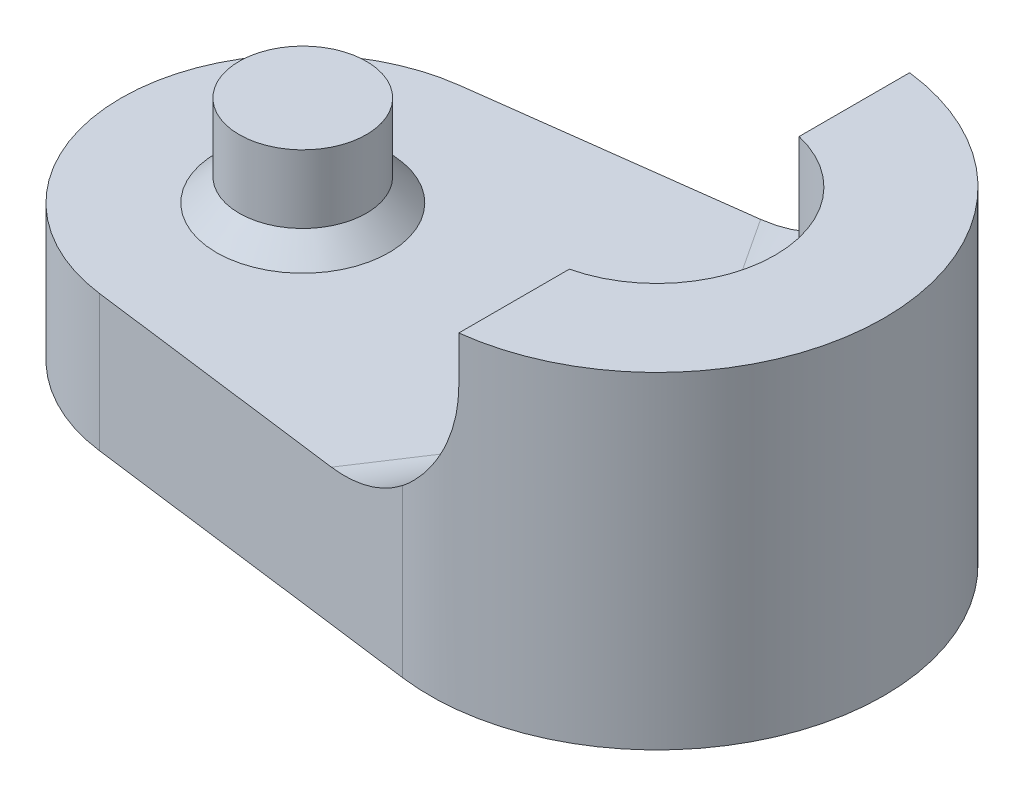
ISO-10303-21;
HEADER;
FILE_DESCRIPTION(('STEP AP214'),'2;1');
FILE_NAME('part.step','',(''),(''),'','','');
FILE_SCHEMA(('AUTOMOTIVE_DESIGN { 1 0 10303 214 1 1 1 1 }'));
ENDSEC;
DATA;
#1=APPLICATION_CONTEXT('core data for automotive mechanical design processes');
#2=APPLICATION_PROTOCOL_DEFINITION('international standard','automotive_design',2000,#1);
#3=PRODUCT_CONTEXT('',#1,'mechanical');
#4=PRODUCT('Part','Part','',(#3));
#5=PRODUCT_RELATED_PRODUCT_CATEGORY('part','',(#4));
#6=PRODUCT_DEFINITION_FORMATION('','',#4);
#7=PRODUCT_DEFINITION_CONTEXT('part definition',#1,'design');
#8=PRODUCT_DEFINITION('design','',#6,#7);
#9=PRODUCT_DEFINITION_SHAPE('','',#8);
#10=(LENGTH_UNIT() NAMED_UNIT(*) SI_UNIT(.MILLI.,.METRE.));
#11=(NAMED_UNIT(*) PLANE_ANGLE_UNIT() SI_UNIT($,.RADIAN.));
#12=(NAMED_UNIT(*) SI_UNIT($,.STERADIAN.) SOLID_ANGLE_UNIT());
#13=UNCERTAINTY_MEASURE_WITH_UNIT(LENGTH_MEASURE(1.E-05),#10,'distance_accuracy_value','');
#14=(GEOMETRIC_REPRESENTATION_CONTEXT(3) GLOBAL_UNCERTAINTY_ASSIGNED_CONTEXT((#13)) GLOBAL_UNIT_ASSIGNED_CONTEXT((#10,
#11,#12)) REPRESENTATION_CONTEXT('',''));
#15=CARTESIAN_POINT('',(0.,0.,0.));
#16=DIRECTION('',(0.,0.,1.));
#17=DIRECTION('',(1.,0.,0.));
#18=AXIS2_PLACEMENT_3D('',#15,#16,#17);
#19=CARTESIAN_POINT('',(-1.95,1.5,0.));
#20=DIRECTION('',(0.,1.,0.));
#21=DIRECTION('',(0.,0.,1.));
#22=AXIS2_PLACEMENT_3D('',#19,#20,#21);
#23=PLANE('',#22);
#24=CARTESIAN_POINT('',(-1.95,1.5,0.));
#25=DIRECTION('',(0.,1.,0.));
#26=DIRECTION('',(0.,0.,1.));
#27=AXIS2_PLACEMENT_3D('',#24,#25,#26);
#28=CIRCLE('',#27,0.950000000000001);
#29=CARTESIAN_POINT('',(-1.95,1.5,0.950000000000001));
#30=VERTEX_POINT('',#29);
#31=EDGE_CURVE('E189',#30,#30,#28,.F.);
#32=ORIENTED_EDGE('',*,*,#31,.T.);
#33=EDGE_LOOP('',(#32));
#34=FACE_BOUND('',#33,.T.);
#35=DIRECTION('',(0.991747672093011,0.,0.128205128205128));
#36=VECTOR('',#35,1.);
#37=CARTESIAN_POINT('',(-2.20641025641026,1.5,1.98349534418602));
#38=LINE('',#37,#36);
#39=CARTESIAN_POINT('',(-2.20641025641026,1.5,1.98349534418602));
#40=VERTEX_POINT('',#39);
#41=CARTESIAN_POINT('',(0.728268226962096,1.5,2.3628668736473));
#42=VERTEX_POINT('',#41);
#43=EDGE_CURVE('E164',#40,#42,#38,.T.);
#44=ORIENTED_EDGE('',*,*,#43,.T.);
#45=CARTESIAN_POINT('',(2.25,1.5,0.0478873989365317));
#46=CARTESIAN_POINT('',(1.98333333333333,1.5,0.453561953980138));
#47=CARTESIAN_POINT('',(1.71666666666667,1.5,0.859236509023745));
#48=CARTESIAN_POINT('',(1.45,1.5,1.26491106406735));
#49=CARTESIAN_POINT('',(1.18333333333333,1.5,1.67058561911096));
#50=CARTESIAN_POINT('',(0.916666666666667,1.5,2.07626017415456));
#51=CARTESIAN_POINT('',(0.65,1.5,2.48193472919817));
#52=CARTESIAN_POINT('',(0.0882208482646619,1.5,3.33655788199695));
#53=CARTESIAN_POINT('',(-0.473558303470676,1.5,4.19118103479573));
#54=CARTESIAN_POINT('',(-1.03533745520601,1.5,5.04580418759451));
#55=(BOUNDED_CURVE() B_SPLINE_CURVE(3,(#45,#46,#47,#48,#49,#50,#51,#52,#53,#54),.UNSPECIFIED.,
.F.,.F.) B_SPLINE_CURVE_WITH_KNOTS((4,3,3,4),(-0.00121702366513082,0.,0.00121702366513082,
0.00378089312352716),
.UNSPECIFIED.) CURVE() GEOMETRIC_REPRESENTATION_ITEM() RATIONAL_B_SPLINE_CURVE((1.,1.,1.,1.,1.,
1.,1.,1.,1.,1.)) REPRESENTATION_ITEM(''));
#56=CARTESIAN_POINT('',(1.48377941939599,1.5,1.21352312306823));
#57=VERTEX_POINT('',#56);
#58=EDGE_CURVE('E265',#42,#57,#55,.F.);
#59=ORIENTED_EDGE('',*,*,#58,.T.);
#60=CARTESIAN_POINT('',(1.95,1.5,0.));
#61=DIRECTION('',(0.,1.,0.));
#62=DIRECTION('',(0.,0.,1.));
#63=AXIS2_PLACEMENT_3D('',#60,#61,#62);
#64=CIRCLE('',#63,1.3);
#65=CARTESIAN_POINT('',(1.48377941939599,1.5,-1.21352312306823));
#66=VERTEX_POINT('',#65);
#67=EDGE_CURVE('E155',#66,#57,#64,.T.);
#68=ORIENTED_EDGE('',*,*,#67,.F.);
#69=CARTESIAN_POINT('',(-1.03533745520602,1.5,-5.04580418759451));
#70=CARTESIAN_POINT('',(-0.473558303470677,1.5,-4.19118103479573));
#71=CARTESIAN_POINT('',(0.0882208482646616,1.5,-3.33655788199695));
#72=CARTESIAN_POINT('',(0.65,1.5,-2.48193472919817));
#73=CARTESIAN_POINT('',(0.916666666666667,1.5,-2.07626017415456));
#74=CARTESIAN_POINT('',(1.18333333333333,1.5,-1.67058561911096));
#75=CARTESIAN_POINT('',(1.45,1.5,-1.26491106406735));
#76=CARTESIAN_POINT('',(1.71666666666667,1.5,-0.859236509023747));
#77=CARTESIAN_POINT('',(1.98333333333333,1.5,-0.453561953980141));
#78=CARTESIAN_POINT('',(2.25,1.5,-0.0478873989365352));
#79=(BOUNDED_CURVE() B_SPLINE_CURVE(3,(#69,#70,#71,#72,#73,#74,#75,#76,#77,#78),.UNSPECIFIED.,
.F.,.F.) B_SPLINE_CURVE_WITH_KNOTS((4,3,3,4),(-0.00256386945839634,0.,0.00121702366513082,
0.00243404733026163),
.UNSPECIFIED.) CURVE() GEOMETRIC_REPRESENTATION_ITEM() RATIONAL_B_SPLINE_CURVE((1.,1.,1.,1.,1.,
1.,1.,1.,1.,1.)) REPRESENTATION_ITEM(''));
#80=CARTESIAN_POINT('',(0.728268226962096,1.5,-2.3628668736473));
#81=VERTEX_POINT('',#80);
#82=EDGE_CURVE('E196',#66,#81,#79,.F.);
#83=ORIENTED_EDGE('',*,*,#82,.T.);
#84=DIRECTION('',(-0.991747672093011,0.,0.128205128205128));
#85=VECTOR('',#84,1.);
#86=CARTESIAN_POINT('',(-2.20641025641026,1.5,-1.98349534418602));
#87=LINE('',#86,#85);
#88=CARTESIAN_POINT('',(-2.20641025641026,1.5,-1.98349534418602));
#89=VERTEX_POINT('',#88);
#90=EDGE_CURVE('E167',#81,#89,#87,.T.);
#91=ORIENTED_EDGE('',*,*,#90,.T.);
#92=CARTESIAN_POINT('',(-1.95,1.5,0.));
#93=DIRECTION('',(0.,1.,0.));
#94=DIRECTION('',(0.,0.,1.));
#95=AXIS2_PLACEMENT_3D('',#92,#93,#94);
#96=CIRCLE('',#95,2.);
#97=EDGE_CURVE('E161',#89,#40,#96,.T.);
#98=ORIENTED_EDGE('',*,*,#97,.T.);
#99=EDGE_LOOP('',(#44,#59,#68,#83,#91,#98));
#100=FACE_BOUND('',#99,.T.);
#101=ADVANCED_FACE('F38',(#34,#100),#23,.T.);
#102=CARTESIAN_POINT('',(-1.95,0.,0.));
#103=DIRECTION('',(0.,1.,0.));
#104=DIRECTION('',(0.,0.,1.));
#105=AXIS2_PLACEMENT_3D('',#102,#103,#104);
#106=PLANE('',#105);
#107=CARTESIAN_POINT('',(-1.95,0.,0.));
#108=DIRECTION('',(0.,1.,0.));
#109=DIRECTION('',(0.,0.,1.));
#110=AXIS2_PLACEMENT_3D('',#107,#108,#109);
#111=CIRCLE('',#110,2.);
#112=CARTESIAN_POINT('',(-2.20641025641026,0.,-1.98349534418602));
#113=VERTEX_POINT('',#112);
#114=CARTESIAN_POINT('',(-2.20641025641026,0.,1.98349534418602));
#115=VERTEX_POINT('',#114);
#116=EDGE_CURVE('E158',#113,#115,#111,.T.);
#117=ORIENTED_EDGE('',*,*,#116,.F.);
#118=DIRECTION('',(-0.991747672093011,0.,0.128205128205128));
#119=VECTOR('',#118,1.);
#120=CARTESIAN_POINT('',(-2.20641025641026,0.,-1.98349534418602));
#121=LINE('',#120,#119);
#122=CARTESIAN_POINT('',(1.62948717948718,0.,-2.47936918023253));
#123=VERTEX_POINT('',#122);
#124=EDGE_CURVE('E165',#123,#113,#121,.T.);
#125=ORIENTED_EDGE('',*,*,#124,.F.);
#126=CARTESIAN_POINT('',(1.95,0.,0.));
#127=DIRECTION('',(0.,1.,0.));
#128=DIRECTION('',(0.,0.,1.));
#129=AXIS2_PLACEMENT_3D('',#126,#127,#128);
#130=CIRCLE('',#129,2.5);
#131=CARTESIAN_POINT('',(1.62948717948718,0.,2.47936918023253));
#132=VERTEX_POINT('',#131);
#133=EDGE_CURVE('E174',#132,#123,#130,.T.);
#134=ORIENTED_EDGE('',*,*,#133,.F.);
#135=DIRECTION('',(0.991747672093011,0.,0.128205128205128));
#136=VECTOR('',#135,1.);
#137=CARTESIAN_POINT('',(-2.20641025641026,0.,1.98349534418602));
#138=LINE('',#137,#136);
#139=EDGE_CURVE('E172',#115,#132,#138,.T.);
#140=ORIENTED_EDGE('',*,*,#139,.F.);
#141=EDGE_LOOP('',(#117,#125,#134,#140));
#142=FACE_BOUND('',#141,.T.);
#143=CARTESIAN_POINT('',(1.95,0.,0.));
#144=DIRECTION('',(0.,1.,0.));
#145=DIRECTION('',(0.,0.,1.));
#146=AXIS2_PLACEMENT_3D('',#143,#144,#145);
#147=CIRCLE('',#146,1.3);
#148=CARTESIAN_POINT('',(1.95,0.,1.3));
#149=VERTEX_POINT('',#148);
#150=EDGE_CURVE('E149',#149,#149,#147,.T.);
#151=ORIENTED_EDGE('',*,*,#150,.T.);
#152=EDGE_LOOP('',(#151));
#153=FACE_BOUND('',#152,.T.);
#154=ADVANCED_FACE('F237',(#142,#153),#106,.F.);
#155=CARTESIAN_POINT('',(-1.95,1.5,0.));
#156=DIRECTION('',(0.,-1.,0.));
#157=DIRECTION('',(0.,0.,-1.));
#158=AXIS2_PLACEMENT_3D('',#155,#156,#157);
#159=CYLINDRICAL_SURFACE('',#158,2.);
#160=ORIENTED_EDGE('',*,*,#116,.T.);
#161=DIRECTION('',(0.,-1.,0.));
#162=VECTOR('',#161,1.);
#163=CARTESIAN_POINT('',(-2.20641025641026,1.5,1.98349534418602));
#164=LINE('',#163,#162);
#165=EDGE_CURVE('E183',#40,#115,#164,.T.);
#166=ORIENTED_EDGE('',*,*,#165,.F.);
#167=ORIENTED_EDGE('',*,*,#97,.F.);
#168=DIRECTION('',(0.,-1.,0.));
#169=VECTOR('',#168,1.);
#170=CARTESIAN_POINT('',(-2.20641025641026,1.5,-1.98349534418602));
#171=LINE('',#170,#169);
#172=EDGE_CURVE('E169',#89,#113,#171,.T.);
#173=ORIENTED_EDGE('',*,*,#172,.T.);
#174=EDGE_LOOP('',(#160,#166,#167,#173));
#175=FACE_BOUND('',#174,.T.);
#176=ADVANCED_FACE('F240',(#175),#159,.T.);
#177=CARTESIAN_POINT('',(-2.20641025641026,1.5,1.98349534418602));
#178=DIRECTION('',(0.128205128205128,0.,-0.991747672093011));
#179=DIRECTION('',(-0.991747672093011,0.,-0.128205128205128));
#180=AXIS2_PLACEMENT_3D('',#177,#178,#179);
#181=PLANE('',#180);
#182=ORIENTED_EDGE('',*,*,#139,.T.);
#183=DIRECTION('',(0.,-1.,0.));
#184=VECTOR('',#183,1.);
#185=CARTESIAN_POINT('',(1.62948717948718,1.5,2.47936918023253));
#186=LINE('',#185,#184);
#187=CARTESIAN_POINT('',(1.62948717948718,1.83399083544573,2.47936918023253));
#188=VERTEX_POINT('',#187);
#189=EDGE_CURVE('E62',#188,#132,#186,.T.);
#190=ORIENTED_EDGE('',*,*,#189,.F.);
#191=CARTESIAN_POINT('',(1.62948717948717,1.83399083544573,2.47936918023253));
#192=CARTESIAN_POINT('',(1.5955461922025,1.80627529736434,2.47498156355473));
#193=CARTESIAN_POINT('',(1.56048773265527,1.7799745919986,2.47044948908922));
#194=CARTESIAN_POINT('',(1.4882830872755,1.73042627487026,2.46111545576763));
#195=CARTESIAN_POINT('',(1.45113577464485,1.70718033395426,2.45631335124821));
#196=CARTESIAN_POINT('',(1.33918486993886,1.64373282124345,2.44184124257139));
#197=CARTESIAN_POINT('',(1.26175727679426,1.60809110832618,2.43183202875113));
#198=CARTESIAN_POINT('',(1.11007517879688,1.5540903227285,2.41222379233437));
#199=CARTESIAN_POINT('',(1.03631154241862,1.5343321733251,2.40268822524925));
#200=CARTESIAN_POINT('',(0.923013049899757,1.5140070727283,2.38804191130513));
#201=CARTESIAN_POINT('',(0.884265103293614,1.50877999485394,2.38303288975447));
#202=CARTESIAN_POINT('',(0.806441544547307,1.50177416629063,2.37297248869964));
#203=CARTESIAN_POINT('',(0.767365749930183,1.49999748435313,2.36792108560632));
#204=CARTESIAN_POINT('',(0.728268226962095,1.5,2.36286687364729));
#205=B_SPLINE_CURVE_WITH_KNOTS('',3,(#191,#192,#193,#194,#195,#196,#197,#198,#199,#200,#201,
#202,#203,#204),.UNSPECIFIED.,.F.,.F.,(4,2,2,2,2,2,4),(0.,0.132044478877511,0.264160883374298,
0.520259154533056,0.750054255154666,0.868172488694359,0.986361520461867),.UNSPECIFIED.);
#206=EDGE_CURVE('E55',#188,#42,#205,.T.);
#207=ORIENTED_EDGE('',*,*,#206,.T.);
#208=ORIENTED_EDGE('',*,*,#43,.F.);
#209=ORIENTED_EDGE('',*,*,#165,.T.);
#210=EDGE_LOOP('',(#182,#190,#207,#208,#209));
#211=FACE_BOUND('',#210,.T.);
#212=ADVANCED_FACE('F249',(#211),#181,.F.);
#213=CARTESIAN_POINT('',(1.95,1.5,0.));
#214=DIRECTION('',(0.,-1.,0.));
#215=DIRECTION('',(0.,0.,-1.));
#216=AXIS2_PLACEMENT_3D('',#213,#214,#215);
#217=CYLINDRICAL_SURFACE('',#216,2.5);
#218=ORIENTED_EDGE('',*,*,#133,.T.);
#219=DIRECTION('',(0.,-1.,0.));
#220=VECTOR('',#219,1.);
#221=CARTESIAN_POINT('',(1.62948717948718,1.5,-2.47936918023253));
#222=LINE('',#221,#220);
#223=CARTESIAN_POINT('',(1.62948717948718,1.83399083544574,-2.47936918023253));
#224=VERTEX_POINT('',#223);
#225=EDGE_CURVE('E179',#224,#123,#222,.T.);
#226=ORIENTED_EDGE('',*,*,#225,.F.);
#227=CARTESIAN_POINT('',(1.62948717948718,1.83399083544574,-2.47936918023253));
#228=CARTESIAN_POINT('',(1.70105575910475,1.89247713305812,-2.48864275096764));
#229=CARTESIAN_POINT('',(1.76835395239378,1.95668953550387,-2.49416732081789));
#230=CARTESIAN_POINT('',(1.89227030079636,2.09511354734543,-2.50009930994737));
#231=CARTESIAN_POINT('',(1.94887025061998,2.16934183955085,-2.50049808250148));
#232=CARTESIAN_POINT('',(2.04922710885503,2.32650144380881,-2.49853953527265));
#233=CARTESIAN_POINT('',(2.09292304970555,2.40947163403782,-2.49616938616917));
#234=CARTESIAN_POINT('',(2.16491873446402,2.58168008727359,-2.49100909293019));
#235=CARTESIAN_POINT('',(2.19325557074806,2.67090265633118,-2.48821998160588));
#236=CARTESIAN_POINT('',(2.22557457770169,2.81732800737346,-2.48479527492247));
#237=CARTESIAN_POINT('',(2.23474632412085,2.87342606027837,-2.48374404577562));
#238=CARTESIAN_POINT('',(2.24697012809617,2.98634248205956,-2.48230125439896));
#239=CARTESIAN_POINT('',(2.25001700290131,3.04316142006379,-2.48191025088436));
#240=CARTESIAN_POINT('',(2.25,3.1,-2.48193472919817));
#241=B_SPLINE_CURVE_WITH_KNOTS('',3,(#227,#228,#229,#230,#231,#232,#233,#234,#235,#236,#237,
#238,#239,#240),.UNSPECIFIED.,.F.,.F.,(4,2,2,2,2,2,4),(0.,0.278266969803323,0.557003287633527,
0.837036221076233,1.11638982461493,1.28663445817608,1.45702308900243),.UNSPECIFIED.);
#242=CARTESIAN_POINT('',(2.25,3.1,-2.48193472919817));
#243=VERTEX_POINT('',#242);
#244=EDGE_CURVE('E145',#224,#243,#241,.T.);
#245=ORIENTED_EDGE('',*,*,#244,.T.);
#246=DIRECTION('',(0.,-1.,0.));
#247=VECTOR('',#246,1.);
#248=CARTESIAN_POINT('',(2.25,3.6,-2.48193472919817));
#249=LINE('',#248,#247);
#250=CARTESIAN_POINT('',(2.25,3.6,-2.48193472919817));
#251=VERTEX_POINT('',#250);
#252=EDGE_CURVE('E126',#251,#243,#249,.T.);
#253=ORIENTED_EDGE('',*,*,#252,.F.);
#254=CARTESIAN_POINT('',(1.95,3.6,0.));
#255=DIRECTION('',(0.,1.,0.));
#256=DIRECTION('',(0.,0.,1.));
#257=AXIS2_PLACEMENT_3D('',#254,#255,#256);
#258=CIRCLE('',#257,2.5);
#259=CARTESIAN_POINT('',(2.25,3.6,2.48193472919817));
#260=VERTEX_POINT('',#259);
#261=EDGE_CURVE('E133',#260,#251,#258,.T.);
#262=ORIENTED_EDGE('',*,*,#261,.F.);
#263=DIRECTION('',(0.,-1.,0.));
#264=VECTOR('',#263,1.);
#265=CARTESIAN_POINT('',(2.25,3.6,2.48193472919817));
#266=LINE('',#265,#264);
#267=CARTESIAN_POINT('',(2.25,3.1,2.48193472919817));
#268=VERTEX_POINT('',#267);
#269=EDGE_CURVE('E296',#260,#268,#266,.T.);
#270=ORIENTED_EDGE('',*,*,#269,.T.);
#271=CARTESIAN_POINT('',(2.25,3.1,2.48193472919817));
#272=CARTESIAN_POINT('',(2.25000879050873,3.05598990981399,2.4819247628381));
#273=CARTESIAN_POINT('',(2.24818466072886,3.01197752402537,2.48215384376829));
#274=CARTESIAN_POINT('',(2.24085849824069,2.92426709204744,2.4830277395688));
#275=CARTESIAN_POINT('',(2.2353566774593,2.88056902789199,2.48367253048376));
#276=CARTESIAN_POINT('',(2.22069210058739,2.79397242919998,2.4853122532686));
#277=CARTESIAN_POINT('',(2.21154389419752,2.75107141793245,2.48630579171795));
#278=CARTESIAN_POINT('',(2.18965973151081,2.66621419572325,2.48851027781271));
#279=CARTESIAN_POINT('',(2.17692397491318,2.62425793233301,2.48972121335547));
#280=CARTESIAN_POINT('',(2.13347785942263,2.50019377247089,2.49342956494956));
#281=CARTESIAN_POINT('',(2.09752418031251,2.41986437612688,2.49600320387902));
#282=CARTESIAN_POINT('',(2.01318406772981,2.26599452101105,2.49955502488782));
#283=CARTESIAN_POINT('',(1.96479023984994,2.19245813545611,2.50053225551457));
#284=CARTESIAN_POINT('',(1.86983243355291,2.06955880630217,2.49905560406626));
#285=CARTESIAN_POINT('',(1.82540180788967,2.01852330234217,2.49733833311121));
#286=CARTESIAN_POINT('',(1.73122661779512,1.92198969879646,2.49085732702117));
#287=CARTESIAN_POINT('',(1.68149023948126,1.87648329406757,2.48609822999522));
#288=CARTESIAN_POINT('',(1.62948717948717,1.83399083544573,2.47936918023253));
#289=B_SPLINE_CURVE_WITH_KNOTS('',3,(#271,#272,#273,#274,#275,#276,#277,#278,#279,#280,#281,
#282,#283,#284,#285,#286,#287,#288),.UNSPECIFIED.,.F.,.F.,(4,2,2,2,2,2,2,2,4),(0.,
0.131994331612546,0.263981057708826,0.395446323504045,0.526904272796264,0.789741631194498,
1.05273558246909,1.25531583145786,1.45758792507078),.UNSPECIFIED.);
#290=EDGE_CURVE('E259',#268,#188,#289,.T.);
#291=ORIENTED_EDGE('',*,*,#290,.T.);
#292=ORIENTED_EDGE('',*,*,#189,.T.);
#293=EDGE_LOOP('',(#218,#226,#245,#253,#262,#270,#291,#292));
#294=FACE_BOUND('',#293,.T.);
#295=ADVANCED_FACE('F143',(#294),#217,.T.);
#296=CARTESIAN_POINT('',(-2.20641025641026,1.5,-1.98349534418602));
#297=DIRECTION('',(0.128205128205128,0.,0.991747672093011));
#298=DIRECTION('',(0.991747672093011,0.,-0.128205128205128));
#299=AXIS2_PLACEMENT_3D('',#296,#297,#298);
#300=PLANE('',#299);
#301=ORIENTED_EDGE('',*,*,#124,.T.);
#302=ORIENTED_EDGE('',*,*,#172,.F.);
#303=ORIENTED_EDGE('',*,*,#90,.F.);
#304=CARTESIAN_POINT('',(0.728268226962095,1.5,-2.3628668736473));
#305=CARTESIAN_POINT('',(0.765975413030765,1.49999908958451,-2.36774135408241));
#306=CARTESIAN_POINT('',(0.803660104356492,1.5016506654709,-2.37261292657886));
#307=CARTESIAN_POINT('',(0.878738010381242,1.50816893117793,-2.38231839182786));
#308=CARTESIAN_POINT('',(0.916131354474136,1.51303410042604,-2.38715230130741));
#309=CARTESIAN_POINT('',(1.02735173422594,1.53228194502633,-2.40152997361896));
#310=CARTESIAN_POINT('',(1.10043154211616,1.55131799159675,-2.41097714088077));
#311=CARTESIAN_POINT('',(1.24252553921725,1.60067287560993,-2.42934590506156));
#312=CARTESIAN_POINT('',(1.31154609262603,1.63097347477497,-2.43826832469264));
#313=CARTESIAN_POINT('',(1.44425940108643,1.70160052612708,-2.45542442921849));
#314=CARTESIAN_POINT('',(1.50795781029103,1.74191615278025,-2.46365884503648));
#315=CARTESIAN_POINT('',(1.589171283406,1.80187109216319,-2.47415746683885));
#316=CARTESIAN_POINT('',(1.60953090991301,1.81769035601292,-2.47678939489877));
#317=CARTESIAN_POINT('',(1.62948717948718,1.83399083544574,-2.47936918023253));
#318=B_SPLINE_CURVE_WITH_KNOTS('',3,(#304,#305,#306,#307,#308,#309,#310,#311,#312,#313,#314,
#315,#316,#317),.UNSPECIFIED.,.F.,.F.,(4,2,2,2,2,2,4),(0.,0.113985302628292,0.227916709552004,
0.455145049520356,0.682007078318907,0.908624944341588,0.986339527476609),.UNSPECIFIED.);
#319=EDGE_CURVE('E212',#81,#224,#318,.T.);
#320=ORIENTED_EDGE('',*,*,#319,.T.);
#321=ORIENTED_EDGE('',*,*,#225,.T.);
#322=EDGE_LOOP('',(#301,#302,#303,#320,#321));
#323=FACE_BOUND('',#322,.T.);
#324=ADVANCED_FACE('F231',(#323),#300,.F.);
#325=CARTESIAN_POINT('',(1.95,1.5,0.));
#326=DIRECTION('',(0.,-1.,0.));
#327=DIRECTION('',(0.,0.,-1.));
#328=AXIS2_PLACEMENT_3D('',#325,#326,#327);
#329=CYLINDRICAL_SURFACE('',#328,1.3);
#330=DIRECTION('',(0.,-1.,0.));
#331=VECTOR('',#330,1.);
#332=CARTESIAN_POINT('',(2.25,3.6,-1.26491106406735));
#333=LINE('',#332,#331);
#334=CARTESIAN_POINT('',(2.25,3.6,-1.26491106406735));
#335=VERTEX_POINT('',#334);
#336=CARTESIAN_POINT('',(2.25,2.3,-1.26491106406735));
#337=VERTEX_POINT('',#336);
#338=EDGE_CURVE('E129',#335,#337,#333,.T.);
#339=ORIENTED_EDGE('',*,*,#338,.T.);
#340=CARTESIAN_POINT('',(2.25,2.3,-1.26491106406735));
#341=CARTESIAN_POINT('',(2.25000500053444,2.27879968581783,-1.26490576944664));
#342=CARTESIAN_POINT('',(2.24915752793694,2.25759617959292,-1.26511069723));
#343=CARTESIAN_POINT('',(2.24572796814672,2.21533683602119,-1.26591898392276));
#344=CARTESIAN_POINT('',(2.24314577973485,2.19428100736368,-1.26652236608159));
#345=CARTESIAN_POINT('',(2.23623287139765,2.1525686712756,-1.26810194246152));
#346=CARTESIAN_POINT('',(2.23191015879791,2.1319107830704,-1.26907642831264));
#347=CARTESIAN_POINT('',(2.22153703764865,2.09105862965248,-1.27133617612255));
#348=CARTESIAN_POINT('',(2.21548679997864,2.07086431879798,-1.2726214073418));
#349=CARTESIAN_POINT('',(2.19479179675657,2.01115263343269,-1.27682312534923));
#350=CARTESIAN_POINT('',(2.17760351210626,1.97251113859234,-1.28008542992993));
#351=CARTESIAN_POINT('',(2.13720883561111,1.89854559295715,-1.28661102901806));
#352=CARTESIAN_POINT('',(2.11399926717062,1.86322330668736,-1.28987432313711));
#353=CARTESIAN_POINT('',(2.06146325963359,1.7950772695229,-1.29549246145701));
#354=CARTESIAN_POINT('',(2.0319285196987,1.76241092926649,-1.29780553707896));
#355=CARTESIAN_POINT('',(1.96830406588197,1.70163285281649,-1.3002617124081));
#356=CARTESIAN_POINT('',(1.93420496296658,1.67353077647546,-1.30040026767245));
#357=CARTESIAN_POINT('',(1.85928793886078,1.62029890519047,-1.29741921374669));
#358=CARTESIAN_POINT('',(1.81814371982473,1.59563898194087,-1.294015689316));
#359=CARTESIAN_POINT('',(1.73298924229335,1.55373985236944,-1.28247260099264));
#360=CARTESIAN_POINT('',(1.6889945648359,1.5364636730346,-1.27435712556903));
#361=CARTESIAN_POINT('',(1.61779721414643,1.51622260362135,-1.2571346476501));
#362=CARTESIAN_POINT('',(1.5910115837527,1.51029534024782,-1.24976098774982));
#363=CARTESIAN_POINT('',(1.53732350766313,1.50217814178471,-1.23308685433467));
#364=CARTESIAN_POINT('',(1.5104212134184,1.50000858719245,-1.22377617836699));
#365=CARTESIAN_POINT('',(1.48377941939599,1.5,-1.21352312306823));
#366=B_SPLINE_CURVE_WITH_KNOTS('',3,(#340,#341,#342,#343,#344,#345,#346,#347,#348,#349,#350,
#351,#352,#353,#354,#355,#356,#357,#358,#359,#360,#361,#362,#363,#364,#365),.UNSPECIFIED.,.F.,
.F.,(4,2,2,2,2,2,2,2,2,2,2,2,4),(0.,0.0635871851029135,0.127178080784986,0.19047970788912,
0.253775075630403,0.380379727300016,0.507051306976291,0.638812409348257,0.770848837379669,
0.914348547929281,1.05712103795725,1.14205871904978,1.22745564647354),.UNSPECIFIED.);
#367=EDGE_CURVE('E203',#337,#66,#366,.T.);
#368=ORIENTED_EDGE('',*,*,#367,.T.);
#369=ORIENTED_EDGE('',*,*,#67,.T.);
#370=CARTESIAN_POINT('',(1.48377941939599,1.5,1.21352312306823));
#371=CARTESIAN_POINT('',(1.51352457812165,1.50001354005648,1.22497956669578));
#372=CARTESIAN_POINT('',(1.54358806152211,1.50271467334166,1.23524613053568));
#373=CARTESIAN_POINT('',(1.60347307884973,1.51274100527367,1.25334450746959));
#374=CARTESIAN_POINT('',(1.63329490133108,1.52003560518274,1.2611919240769));
#375=CARTESIAN_POINT('',(1.70046914218484,1.54110137962396,1.2764154973737));
#376=CARTESIAN_POINT('',(1.73759504943834,1.55611332667961,1.28304603160159));
#377=CARTESIAN_POINT('',(1.80981207611384,1.5914370429817,1.29293500200165));
#378=CARTESIAN_POINT('',(1.84489592063391,1.61176649311121,1.29618200483499));
#379=CARTESIAN_POINT('',(1.91264407882543,1.65727385277422,1.29991225000417));
#380=CARTESIAN_POINT('',(1.94526629193724,1.68251734513054,1.30035503394509));
#381=CARTESIAN_POINT('',(2.0067595789733,1.73712955474823,1.29912439631095));
#382=CARTESIAN_POINT('',(2.03563276976316,1.76649592438007,1.29745217474259));
#383=CARTESIAN_POINT('',(2.09302803992969,1.83389126751759,1.29247664001786));
#384=CARTESIAN_POINT('',(2.1207910541217,1.87255685917939,1.28895937825967));
#385=CARTESIAN_POINT('',(2.16891166313653,1.95426176293036,1.28166929619492));
#386=CARTESIAN_POINT('',(2.18927502340342,1.99729763631471,1.2778966775805));
#387=CARTESIAN_POINT('',(2.21279453748497,2.06241875715037,1.27318301263919));
#388=CARTESIAN_POINT('',(2.21931140150702,2.08330435590105,1.27181125024204));
#389=CARTESIAN_POINT('',(2.23048898829603,2.12559272658981,1.26939309639992));
#390=CARTESIAN_POINT('',(2.23514962383752,2.14699552278125,1.26834672024558));
#391=CARTESIAN_POINT('',(2.24260560391154,2.19024738498243,1.26664813292208));
#392=CARTESIAN_POINT('',(2.24539143945414,2.21209815526462,1.26599793270942));
#393=CARTESIAN_POINT('',(2.24909157728899,2.25596714098722,1.26512631209962));
#394=CARTESIAN_POINT('',(2.25000583822944,2.27798536011656,1.26490490117645));
#395=CARTESIAN_POINT('',(2.25,2.3,1.26491106406735));
#396=B_SPLINE_CURVE_WITH_KNOTS('',3,(#370,#371,#372,#373,#374,#375,#376,#377,#378,#379,#380,
#381,#382,#383,#384,#385,#386,#387,#388,#389,#390,#391,#392,#393,#394,#395),.UNSPECIFIED.,.F.,
.F.,(4,2,2,2,2,2,2,2,2,2,2,2,4),(0.,0.0952984730049391,0.189968748239402,0.311116181668797,
0.432671671551852,0.555977005105541,0.679212409351301,0.821694037462784,0.964064411693846,
1.02975757082273,1.09545381655489,1.16148081185688,1.22750926598671),.UNSPECIFIED.);
#397=CARTESIAN_POINT('',(2.25,2.3,1.26491106406735));
#398=VERTEX_POINT('',#397);
#399=EDGE_CURVE('E11',#57,#398,#396,.T.);
#400=ORIENTED_EDGE('',*,*,#399,.T.);
#401=DIRECTION('',(0.,-1.,0.));
#402=VECTOR('',#401,1.);
#403=CARTESIAN_POINT('',(2.25,3.6,1.26491106406735));
#404=LINE('',#403,#402);
#405=CARTESIAN_POINT('',(2.25,3.6,1.26491106406735));
#406=VERTEX_POINT('',#405);
#407=EDGE_CURVE('E151',#406,#398,#404,.T.);
#408=ORIENTED_EDGE('',*,*,#407,.F.);
#409=CARTESIAN_POINT('',(1.95,3.6,0.));
#410=DIRECTION('',(0.,-1.,0.));
#411=DIRECTION('',(0.,0.,1.));
#412=AXIS2_PLACEMENT_3D('',#409,#410,#411);
#413=CIRCLE('',#412,1.3);
#414=EDGE_CURVE('E132',#335,#406,#413,.T.);
#415=ORIENTED_EDGE('',*,*,#414,.F.);
#416=EDGE_LOOP('',(#339,#368,#369,#400,#408,#415));
#417=FACE_BOUND('',#416,.T.);
#418=ORIENTED_EDGE('',*,*,#150,.F.);
#419=EDGE_LOOP('',(#418));
#420=FACE_BOUND('',#419,.T.);
#421=ADVANCED_FACE('F225',(#417,#420),#329,.F.);
#422=CARTESIAN_POINT('',(-1.95,2.5,0.));
#423=DIRECTION('',(0.,-1.,0.));
#424=DIRECTION('',(0.,0.,-1.));
#425=AXIS2_PLACEMENT_3D('',#422,#423,#424);
#426=CYLINDRICAL_SURFACE('',#425,0.7);
#427=CARTESIAN_POINT('',(-1.95,1.75,0.));
#428=DIRECTION('',(0.,1.,0.));
#429=DIRECTION('',(0.,0.,1.));
#430=AXIS2_PLACEMENT_3D('',#427,#428,#429);
#431=CIRCLE('',#430,0.7);
#432=CARTESIAN_POINT('',(-1.95,1.75,0.7));
#433=VERTEX_POINT('',#432);
#434=EDGE_CURVE('E186',#433,#433,#431,.T.);
#435=ORIENTED_EDGE('',*,*,#434,.T.);
#436=EDGE_LOOP('',(#435));
#437=FACE_BOUND('',#436,.T.);
#438=CARTESIAN_POINT('',(-1.95,2.5,0.));
#439=DIRECTION('',(0.,1.,0.));
#440=DIRECTION('',(0.,0.,1.));
#441=AXIS2_PLACEMENT_3D('',#438,#439,#440);
#442=CIRCLE('',#441,0.7);
#443=CARTESIAN_POINT('',(-1.95,2.5,0.7));
#444=VERTEX_POINT('',#443);
#445=EDGE_CURVE('E146',#444,#444,#442,.T.);
#446=ORIENTED_EDGE('',*,*,#445,.F.);
#447=EDGE_LOOP('',(#446));
#448=FACE_BOUND('',#447,.T.);
#449=ADVANCED_FACE('F230',(#437,#448),#426,.T.);
#450=CARTESIAN_POINT('',(-1.95,2.5,0.));
#451=DIRECTION('',(0.,1.,0.));
#452=DIRECTION('',(0.,0.,1.));
#453=AXIS2_PLACEMENT_3D('',#450,#451,#452);
#454=PLANE('',#453);
#455=ORIENTED_EDGE('',*,*,#445,.T.);
#456=EDGE_LOOP('',(#455));
#457=FACE_BOUND('',#456,.T.);
#458=ADVANCED_FACE('F321',(#457),#454,.T.);
#459=CARTESIAN_POINT('',(-1.95,1.75,0.));
#460=DIRECTION('',(0.,-1.,0.));
#461=DIRECTION('',(0.,0.,-1.));
#462=AXIS2_PLACEMENT_3D('',#459,#460,#461);
#463=CONICAL_SURFACE('',#462,0.7,0.785398163397446);
#464=ORIENTED_EDGE('',*,*,#31,.F.);
#465=EDGE_LOOP('',(#464));
#466=FACE_BOUND('',#465,.T.);
#467=ORIENTED_EDGE('',*,*,#434,.F.);
#468=EDGE_LOOP('',(#467));
#469=FACE_BOUND('',#468,.T.);
#470=ADVANCED_FACE('F317',(#466,#469),#463,.T.);
#471=CARTESIAN_POINT('',(2.25,3.6,-2.48193472919817));
#472=DIRECTION('',(1.,0.,0.));
#473=DIRECTION('',(0.,0.,-1.));
#474=AXIS2_PLACEMENT_3D('',#471,#472,#473);
#475=PLANE('',#474);
#476=ORIENTED_EDGE('',*,*,#252,.T.);
#477=CARTESIAN_POINT('',(2.25,4.78533745520602,-5.04580418759451));
#478=CARTESIAN_POINT('',(2.25,4.22355830347068,-4.19118103479573));
#479=CARTESIAN_POINT('',(2.25,3.66177915173534,-3.33655788199695));
#480=CARTESIAN_POINT('',(2.25,3.1,-2.48193472919817));
#481=CARTESIAN_POINT('',(2.25,2.83333333333333,-2.07626017415456));
#482=CARTESIAN_POINT('',(2.25,2.56666666666667,-1.67058561911096));
#483=CARTESIAN_POINT('',(2.25,2.3,-1.26491106406735));
#484=CARTESIAN_POINT('',(2.25,2.03333333333333,-0.859236509023747));
#485=CARTESIAN_POINT('',(2.25,1.76666666666667,-0.453561953980141));
#486=CARTESIAN_POINT('',(2.25,1.5,-0.0478873989365352));
#487=(BOUNDED_CURVE() B_SPLINE_CURVE(3,(#477,#478,#479,#480,#481,#482,#483,#484,#485,#486),
.UNSPECIFIED.,.F.,.F.) B_SPLINE_CURVE_WITH_KNOTS((4,3,3,4),(-0.00256386945839634,0.,
0.00121702366513082,0.00243404733026163),
.UNSPECIFIED.) CURVE() GEOMETRIC_REPRESENTATION_ITEM() RATIONAL_B_SPLINE_CURVE((1.,1.,1.,1.,1.,
1.,1.,1.,1.,1.)) REPRESENTATION_ITEM(''));
#488=EDGE_CURVE('E192',#243,#337,#487,.T.);
#489=ORIENTED_EDGE('',*,*,#488,.T.);
#490=ORIENTED_EDGE('',*,*,#338,.F.);
#491=DIRECTION('',(0.,0.,1.));
#492=VECTOR('',#491,1.);
#493=CARTESIAN_POINT('',(2.25,3.6,-2.48193472919817));
#494=LINE('',#493,#492);
#495=EDGE_CURVE('E121',#251,#335,#494,.T.);
#496=ORIENTED_EDGE('',*,*,#495,.F.);
#497=EDGE_LOOP('',(#476,#489,#490,#496));
#498=FACE_BOUND('',#497,.T.);
#499=ADVANCED_FACE('F123',(#498),#475,.F.);
#500=CARTESIAN_POINT('',(2.25,3.6,1.26491106406735));
#501=DIRECTION('',(1.,0.,0.));
#502=DIRECTION('',(0.,0.,-1.));
#503=AXIS2_PLACEMENT_3D('',#500,#501,#502);
#504=PLANE('',#503);
#505=ORIENTED_EDGE('',*,*,#407,.T.);
#506=CARTESIAN_POINT('',(2.25,1.5,0.0478873989365317));
#507=CARTESIAN_POINT('',(2.25,1.76666666666667,0.453561953980138));
#508=CARTESIAN_POINT('',(2.25,2.03333333333333,0.859236509023745));
#509=CARTESIAN_POINT('',(2.25,2.3,1.26491106406735));
#510=CARTESIAN_POINT('',(2.25,2.56666666666667,1.67058561911096));
#511=CARTESIAN_POINT('',(2.25,2.83333333333333,2.07626017415456));
#512=CARTESIAN_POINT('',(2.25,3.1,2.48193472919817));
#513=CARTESIAN_POINT('',(2.25,3.66177915173534,3.33655788199695));
#514=CARTESIAN_POINT('',(2.25,4.22355830347068,4.19118103479573));
#515=CARTESIAN_POINT('',(2.25,4.78533745520601,5.04580418759451));
#516=(BOUNDED_CURVE() B_SPLINE_CURVE(3,(#506,#507,#508,#509,#510,#511,#512,#513,#514,#515),
.UNSPECIFIED.,.F.,.F.) B_SPLINE_CURVE_WITH_KNOTS((4,3,3,4),(-0.00121702366513082,0.,
0.00121702366513082,0.00378089312352716),
.UNSPECIFIED.) CURVE() GEOMETRIC_REPRESENTATION_ITEM() RATIONAL_B_SPLINE_CURVE((1.,1.,1.,1.,1.,
1.,1.,1.,1.,1.)) REPRESENTATION_ITEM(''));
#517=EDGE_CURVE('E272',#398,#268,#516,.T.);
#518=ORIENTED_EDGE('',*,*,#517,.T.);
#519=ORIENTED_EDGE('',*,*,#269,.F.);
#520=DIRECTION('',(0.,0.,1.));
#521=VECTOR('',#520,1.);
#522=CARTESIAN_POINT('',(2.25,3.6,1.26491106406735));
#523=LINE('',#522,#521);
#524=EDGE_CURVE('E138',#406,#260,#523,.T.);
#525=ORIENTED_EDGE('',*,*,#524,.F.);
#526=EDGE_LOOP('',(#505,#518,#519,#525));
#527=FACE_BOUND('',#526,.T.);
#528=ADVANCED_FACE('F299',(#527),#504,.F.);
#529=CARTESIAN_POINT('',(1.95,3.6,0.));
#530=DIRECTION('',(0.,1.,0.));
#531=DIRECTION('',(0.,0.,1.));
#532=AXIS2_PLACEMENT_3D('',#529,#530,#531);
#533=PLANE('',#532);
#534=ORIENTED_EDGE('',*,*,#261,.T.);
#535=ORIENTED_EDGE('',*,*,#495,.T.);
#536=ORIENTED_EDGE('',*,*,#414,.T.);
#537=ORIENTED_EDGE('',*,*,#524,.T.);
#538=EDGE_LOOP('',(#534,#535,#536,#537));
#539=FACE_BOUND('',#538,.T.);
#540=ADVANCED_FACE('F136',(#539),#533,.T.);
#541=CARTESIAN_POINT('',(2.25,3.28927748887279,-2.76987870824158));
#542=CARTESIAN_POINT('',(2.25,3.22618499258186,-2.67389738189378));
#543=CARTESIAN_POINT('',(2.25,3.16309249629093,-2.57791605554597));
#544=CARTESIAN_POINT('',(2.25,3.1,-2.48193472919817));
#545=CARTESIAN_POINT('',(2.25,2.83333333333333,-2.07626017415456));
#546=CARTESIAN_POINT('',(2.25,2.56666666666667,-1.67058561911096));
#547=CARTESIAN_POINT('',(2.25,2.3,-1.26491106406735));
#548=CARTESIAN_POINT('',(2.25,2.22992824945346,-1.15831234072699));
#549=CARTESIAN_POINT('',(2.25,2.15985649890691,-1.05171361738663));
#550=CARTESIAN_POINT('',(2.25,2.08978474836037,-0.945114894046275));
#551=CARTESIAN_POINT('',(2.25,1.5,-2.76987870824158));
#552=CARTESIAN_POINT('',(2.25,1.5,-2.67389738189378));
#553=CARTESIAN_POINT('',(2.25,1.5,-2.57791605554597));
#554=CARTESIAN_POINT('',(2.25,1.5,-2.48193472919817));
#555=CARTESIAN_POINT('',(2.25,1.5,-2.07626017415456));
#556=CARTESIAN_POINT('',(2.25,1.5,-1.67058561911096));
#557=CARTESIAN_POINT('',(2.25,1.5,-1.26491106406735));
#558=CARTESIAN_POINT('',(2.25,1.5,-1.15831234072699));
#559=CARTESIAN_POINT('',(2.25,1.5,-1.05171361738663));
#560=CARTESIAN_POINT('',(2.25,1.5,-0.945114894046275));
#561=CARTESIAN_POINT('',(0.460722511127206,1.5,-2.76987870824158));
#562=CARTESIAN_POINT('',(0.523815007418137,1.5,-2.67389738189378));
#563=CARTESIAN_POINT('',(0.586907503709069,1.5,-2.57791605554597));
#564=CARTESIAN_POINT('',(0.65,1.5,-2.48193472919817));
#565=CARTESIAN_POINT('',(0.916666666666667,1.5,-2.07626017415456));
#566=CARTESIAN_POINT('',(1.18333333333333,1.5,-1.67058561911096));
#567=CARTESIAN_POINT('',(1.45,1.5,-1.26491106406735));
#568=CARTESIAN_POINT('',(1.52007175054654,1.5,-1.15831234072699));
#569=CARTESIAN_POINT('',(1.59014350109309,1.5,-1.05171361738663));
#570=CARTESIAN_POINT('',(1.66021525163963,1.5,-0.945114894046275));
#571=(BOUNDED_SURFACE() B_SPLINE_SURFACE(2,3,((#541,#542,#543,#544,#545,#546,#547,#548,#549,
#550),(#551,#552,#553,#554,#555,#556,#557,#558,#559,#560),(#561,#562,#563,#564,#565,#566,#567,
#568,#569,#570)),.UNSPECIFIED.,.F.,.F.,.F.) B_SPLINE_SURFACE_WITH_KNOTS((3,3),(4,3,3,4),(0.,1.),
(-0.000287943979043407,0.,0.00121702366513082,0.0015368198351519),
.UNSPECIFIED.) GEOMETRIC_REPRESENTATION_ITEM() RATIONAL_B_SPLINE_SURFACE(((1.,1.,1.,1.,1.,1.,1.,
1.,1.,1.),(0.707106781186548,0.707106781186548,0.707106781186548,0.707106781186548,
0.707106781186548,0.707106781186548,0.707106781186548,0.707106781186548,0.707106781186548,
0.707106781186548),(1.,1.,1.,1.,1.,1.,1.,1.,1.,1.))) REPRESENTATION_ITEM('') SURFACE());
#572=ORIENTED_EDGE('',*,*,#319,.F.);
#573=ORIENTED_EDGE('',*,*,#82,.F.);
#574=ORIENTED_EDGE('',*,*,#367,.F.);
#575=ORIENTED_EDGE('',*,*,#488,.F.);
#576=ORIENTED_EDGE('',*,*,#244,.F.);
#577=EDGE_LOOP('',(#572,#573,#574,#575,#576));
#578=FACE_BOUND('',#577,.T.);
#579=ADVANCED_FACE('F220',(#578),#571,.T.);
#580=CARTESIAN_POINT('',(2.25,2.08980012745092,0.945138289942707));
#581=CARTESIAN_POINT('',(2.25,2.15986675163394,1.05172921465092));
#582=CARTESIAN_POINT('',(2.25,2.22993337581697,1.15832013935914));
#583=CARTESIAN_POINT('',(2.25,2.3,1.26491106406735));
#584=CARTESIAN_POINT('',(2.25,2.56666666666667,1.67058561911096));
#585=CARTESIAN_POINT('',(2.25,2.83333333333333,2.07626017415456));
#586=CARTESIAN_POINT('',(2.25,3.1,2.48193472919817));
#587=CARTESIAN_POINT('',(2.25,3.16306277125411,2.5778708354544));
#588=CARTESIAN_POINT('',(2.25,3.22612554250822,2.67380694171063));
#589=CARTESIAN_POINT('',(2.25,3.28918831376233,2.76974304796686));
#590=CARTESIAN_POINT('',(2.25,1.5,0.945138289942707));
#591=CARTESIAN_POINT('',(2.25,1.5,1.05172921465092));
#592=CARTESIAN_POINT('',(2.25,1.5,1.15832013935914));
#593=CARTESIAN_POINT('',(2.25,1.5,1.26491106406735));
#594=CARTESIAN_POINT('',(2.25,1.5,1.67058561911096));
#595=CARTESIAN_POINT('',(2.25,1.5,2.07626017415456));
#596=CARTESIAN_POINT('',(2.25,1.5,2.48193472919817));
#597=CARTESIAN_POINT('',(2.25,1.5,2.5778708354544));
#598=CARTESIAN_POINT('',(2.25,1.5,2.67380694171063));
#599=CARTESIAN_POINT('',(2.25,1.5,2.76974304796686));
#600=CARTESIAN_POINT('',(1.66019987254908,1.5,0.945138289942707));
#601=CARTESIAN_POINT('',(1.59013324836605,1.5,1.05172921465092));
#602=CARTESIAN_POINT('',(1.52006662418303,1.5,1.15832013935914));
#603=CARTESIAN_POINT('',(1.45,1.5,1.26491106406735));
#604=CARTESIAN_POINT('',(1.18333333333333,1.5,1.67058561911096));
#605=CARTESIAN_POINT('',(0.916666666666667,1.5,2.07626017415456));
#606=CARTESIAN_POINT('',(0.65,1.5,2.48193472919817));
#607=CARTESIAN_POINT('',(0.586937228745888,1.5,2.5778708354544));
#608=CARTESIAN_POINT('',(0.523874457491777,1.5,2.67380694171063));
#609=CARTESIAN_POINT('',(0.460811686237665,1.5,2.76974304796686));
#610=(BOUNDED_SURFACE() B_SPLINE_SURFACE(2,3,((#580,#581,#582,#583,#584,#585,#586,#587,#588,
#589),(#590,#591,#592,#593,#594,#595,#596,#597,#598,#599),(#600,#601,#602,#603,#604,#605,#606,
#607,#608,#609)),.UNSPECIFIED.,.F.,.F.,.F.) B_SPLINE_SURFACE_WITH_KNOTS((3,3),(4,3,3,4),(0.,1.),
(-0.000319772774124645,0.,0.00121702366513082,0.00150483198389951),
.UNSPECIFIED.) GEOMETRIC_REPRESENTATION_ITEM() RATIONAL_B_SPLINE_SURFACE(((1.,1.,1.,1.,1.,1.,1.,
1.,1.,1.),(0.707106781186547,0.707106781186547,0.707106781186547,0.707106781186548,
0.707106781186548,0.707106781186548,0.707106781186548,0.707106781186548,0.707106781186548,
0.707106781186548),(1.,1.,1.,1.,1.,1.,1.,1.,1.,1.))) REPRESENTATION_ITEM('') SURFACE());
#611=ORIENTED_EDGE('',*,*,#399,.F.);
#612=ORIENTED_EDGE('',*,*,#58,.F.);
#613=ORIENTED_EDGE('',*,*,#206,.F.);
#614=ORIENTED_EDGE('',*,*,#290,.F.);
#615=ORIENTED_EDGE('',*,*,#517,.F.);
#616=EDGE_LOOP('',(#611,#612,#613,#614,#615));
#617=FACE_BOUND('',#616,.T.);
#618=ADVANCED_FACE('F41',(#617),#610,.T.);
#619=CLOSED_SHELL('',(#101,#154,#176,#212,#295,#324,#421,#449,#458,#470,#499,#528,#540,#579,#618));
#620=MANIFOLD_SOLID_BREP('B2',#619);
#621=ADVANCED_BREP_SHAPE_REPRESENTATION('',(#18,#620),#14);
#622=SHAPE_DEFINITION_REPRESENTATION(#9,#621);
ENDSEC;
END-ISO-10303-21;
